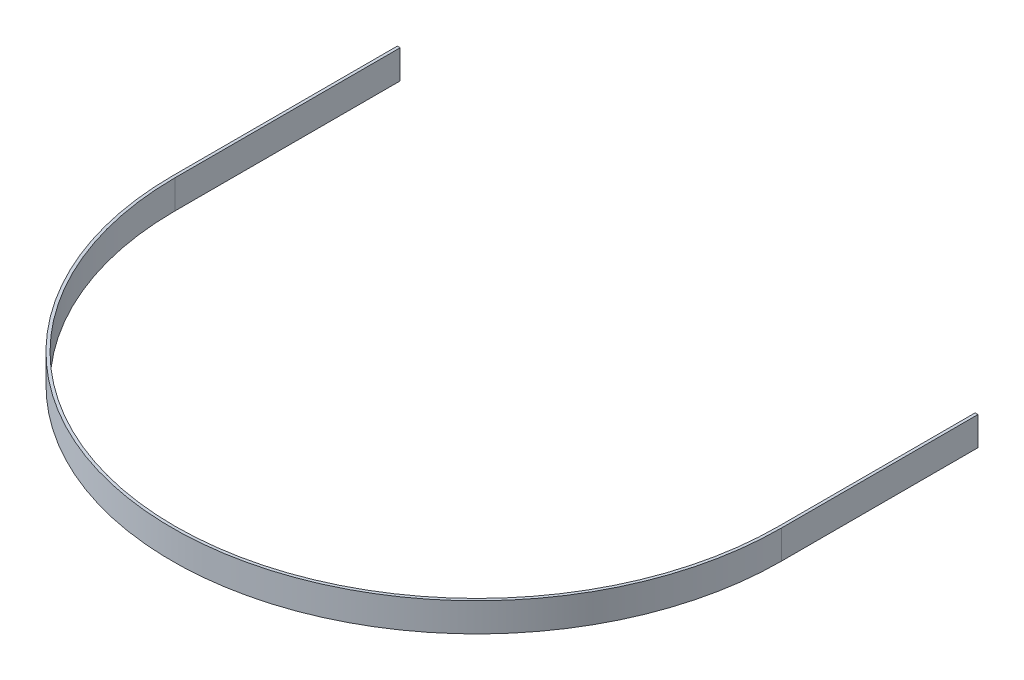
ISO-10303-21;
HEADER;
FILE_DESCRIPTION(('STEP AP214'),'2;1');
FILE_NAME('part.step','',(''),(''),'','','');
FILE_SCHEMA(('AUTOMOTIVE_DESIGN { 1 0 10303 214 1 1 1 1 }'));
ENDSEC;
DATA;
#1=APPLICATION_CONTEXT('core data for automotive mechanical design processes');
#2=APPLICATION_PROTOCOL_DEFINITION('international standard','automotive_design',2000,#1);
#3=PRODUCT_CONTEXT('',#1,'mechanical');
#4=PRODUCT('Part','Part','',(#3));
#5=PRODUCT_RELATED_PRODUCT_CATEGORY('part','',(#4));
#6=PRODUCT_DEFINITION_FORMATION('','',#4);
#7=PRODUCT_DEFINITION_CONTEXT('part definition',#1,'design');
#8=PRODUCT_DEFINITION('design','',#6,#7);
#9=PRODUCT_DEFINITION_SHAPE('','',#8);
#10=(LENGTH_UNIT() NAMED_UNIT(*) SI_UNIT(.MILLI.,.METRE.));
#11=(NAMED_UNIT(*) PLANE_ANGLE_UNIT() SI_UNIT($,.RADIAN.));
#12=(NAMED_UNIT(*) SI_UNIT($,.STERADIAN.) SOLID_ANGLE_UNIT());
#13=UNCERTAINTY_MEASURE_WITH_UNIT(LENGTH_MEASURE(1.E-05),#10,'distance_accuracy_value','');
#14=(GEOMETRIC_REPRESENTATION_CONTEXT(3) GLOBAL_UNCERTAINTY_ASSIGNED_CONTEXT((#13)) GLOBAL_UNIT_ASSIGNED_CONTEXT((#10,
#11,#12)) REPRESENTATION_CONTEXT('',''));
#15=CARTESIAN_POINT('',(0.,0.,0.));
#16=DIRECTION('',(0.,0.,1.));
#17=DIRECTION('',(1.,0.,0.));
#18=AXIS2_PLACEMENT_3D('',#15,#16,#17);
#19=CARTESIAN_POINT('',(-31.8,3.,0.));
#20=DIRECTION('',(0.,0.,1.));
#21=DIRECTION('',(1.,0.,0.));
#22=AXIS2_PLACEMENT_3D('',#19,#20,#21);
#23=PLANE('',#22);
#24=DIRECTION('',(-1.,0.,0.));
#25=VECTOR('',#24,1.);
#26=CARTESIAN_POINT('',(-31.8,0.,0.));
#27=LINE('',#26,#25);
#28=CARTESIAN_POINT('',(-31.5,0.,0.));
#29=VERTEX_POINT('',#28);
#30=CARTESIAN_POINT('',(-31.8,0.,0.));
#31=VERTEX_POINT('',#30);
#32=EDGE_CURVE('E131',#29,#31,#27,.T.);
#33=ORIENTED_EDGE('',*,*,#32,.T.);
#34=DIRECTION('',(0.,-1.,0.));
#35=VECTOR('',#34,1.);
#36=CARTESIAN_POINT('',(-31.8,3.,0.));
#37=LINE('',#36,#35);
#38=CARTESIAN_POINT('',(-31.8,3.,0.));
#39=VERTEX_POINT('',#38);
#40=EDGE_CURVE('E11',#39,#31,#37,.T.);
#41=ORIENTED_EDGE('',*,*,#40,.F.);
#42=DIRECTION('',(-1.,0.,0.));
#43=VECTOR('',#42,1.);
#44=CARTESIAN_POINT('',(-31.8,3.,0.));
#45=LINE('',#44,#43);
#46=CARTESIAN_POINT('',(-31.5,3.,0.));
#47=VERTEX_POINT('',#46);
#48=EDGE_CURVE('E145',#47,#39,#45,.T.);
#49=ORIENTED_EDGE('',*,*,#48,.F.);
#50=DIRECTION('',(0.,-1.,0.));
#51=VECTOR('',#50,1.);
#52=CARTESIAN_POINT('',(-31.5,3.,0.));
#53=LINE('',#52,#51);
#54=EDGE_CURVE('E127',#47,#29,#53,.T.);
#55=ORIENTED_EDGE('',*,*,#54,.T.);
#56=EDGE_LOOP('',(#33,#41,#49,#55));
#57=FACE_BOUND('',#56,.T.);
#58=ADVANCED_FACE('F35',(#57),#23,.F.);
#59=CARTESIAN_POINT('',(-31.8,3.,0.));
#60=DIRECTION('',(1.,0.,0.));
#61=DIRECTION('',(0.,0.,-1.));
#62=AXIS2_PLACEMENT_3D('',#59,#60,#61);
#63=PLANE('',#62);
#64=DIRECTION('',(0.,0.,1.));
#65=VECTOR('',#64,1.);
#66=CARTESIAN_POINT('',(-31.8,0.,0.));
#67=LINE('',#66,#65);
#68=CARTESIAN_POINT('',(-31.8000000000001,0.,23.5));
#69=VERTEX_POINT('',#68);
#70=EDGE_CURVE('E134',#31,#69,#67,.T.);
#71=ORIENTED_EDGE('',*,*,#70,.T.);
#72=DIRECTION('',(0.,-1.,0.));
#73=VECTOR('',#72,1.);
#74=CARTESIAN_POINT('',(-31.8000000000001,3.,23.5));
#75=LINE('',#74,#73);
#76=CARTESIAN_POINT('',(-31.8000000000001,3.,23.5));
#77=VERTEX_POINT('',#76);
#78=EDGE_CURVE('E43',#77,#69,#75,.T.);
#79=ORIENTED_EDGE('',*,*,#78,.F.);
#80=DIRECTION('',(0.,0.,1.));
#81=VECTOR('',#80,1.);
#82=CARTESIAN_POINT('',(-31.8,3.,0.));
#83=LINE('',#82,#81);
#84=EDGE_CURVE('E94',#39,#77,#83,.T.);
#85=ORIENTED_EDGE('',*,*,#84,.F.);
#86=ORIENTED_EDGE('',*,*,#40,.T.);
#87=EDGE_LOOP('',(#71,#79,#85,#86));
#88=FACE_BOUND('',#87,.T.);
#89=ADVANCED_FACE('F180',(#88),#63,.F.);
#90=CARTESIAN_POINT('',(0.,3.,23.5));
#91=DIRECTION('',(0.,-1.,0.));
#92=DIRECTION('',(0.,0.,-1.));
#93=AXIS2_PLACEMENT_3D('',#90,#91,#92);
#94=CYLINDRICAL_SURFACE('',#93,31.8000000000001);
#95=CARTESIAN_POINT('',(0.,0.,23.5));
#96=DIRECTION('',(0.,1.,0.));
#97=DIRECTION('',(0.,0.,1.));
#98=AXIS2_PLACEMENT_3D('',#95,#96,#97);
#99=CIRCLE('',#98,31.8000000000001);
#100=CARTESIAN_POINT('',(31.8000000000001,0.,23.5));
#101=VERTEX_POINT('',#100);
#102=EDGE_CURVE('E136',#69,#101,#99,.T.);
#103=ORIENTED_EDGE('',*,*,#102,.T.);
#104=DIRECTION('',(0.,-1.,0.));
#105=VECTOR('',#104,1.);
#106=CARTESIAN_POINT('',(31.8000000000001,3.,23.5));
#107=LINE('',#106,#105);
#108=CARTESIAN_POINT('',(31.8000000000001,3.,23.5));
#109=VERTEX_POINT('',#108);
#110=EDGE_CURVE('E152',#109,#101,#107,.T.);
#111=ORIENTED_EDGE('',*,*,#110,.F.);
#112=CARTESIAN_POINT('',(0.,3.,23.5));
#113=DIRECTION('',(0.,1.,0.));
#114=DIRECTION('',(0.,0.,1.));
#115=AXIS2_PLACEMENT_3D('',#112,#113,#114);
#116=CIRCLE('',#115,31.8000000000001);
#117=EDGE_CURVE('E160',#77,#109,#116,.T.);
#118=ORIENTED_EDGE('',*,*,#117,.F.);
#119=ORIENTED_EDGE('',*,*,#78,.T.);
#120=EDGE_LOOP('',(#103,#111,#118,#119));
#121=FACE_BOUND('',#120,.T.);
#122=ADVANCED_FACE('F158',(#121),#94,.T.);
#123=CARTESIAN_POINT('',(31.8000000000001,3.,23.5));
#124=DIRECTION('',(-1.,0.,0.));
#125=DIRECTION('',(0.,0.,1.));
#126=AXIS2_PLACEMENT_3D('',#123,#124,#125);
#127=PLANE('',#126);
#128=DIRECTION('',(0.,0.,-1.));
#129=VECTOR('',#128,1.);
#130=CARTESIAN_POINT('',(31.8000000000001,0.,23.5));
#131=LINE('',#130,#129);
#132=CARTESIAN_POINT('',(31.8,0.,3.));
#133=VERTEX_POINT('',#132);
#134=EDGE_CURVE('E138',#101,#133,#131,.T.);
#135=ORIENTED_EDGE('',*,*,#134,.T.);
#136=DIRECTION('',(0.,-1.,0.));
#137=VECTOR('',#136,1.);
#138=CARTESIAN_POINT('',(31.8,3.,3.));
#139=LINE('',#138,#137);
#140=CARTESIAN_POINT('',(31.8,3.,3.));
#141=VERTEX_POINT('',#140);
#142=EDGE_CURVE('E149',#141,#133,#139,.T.);
#143=ORIENTED_EDGE('',*,*,#142,.F.);
#144=DIRECTION('',(0.,0.,-1.));
#145=VECTOR('',#144,1.);
#146=CARTESIAN_POINT('',(31.8000000000001,3.,23.5));
#147=LINE('',#146,#145);
#148=EDGE_CURVE('E172',#109,#141,#147,.T.);
#149=ORIENTED_EDGE('',*,*,#148,.F.);
#150=ORIENTED_EDGE('',*,*,#110,.T.);
#151=EDGE_LOOP('',(#135,#143,#149,#150));
#152=FACE_BOUND('',#151,.T.);
#153=ADVANCED_FACE('F168',(#152),#127,.F.);
#154=CARTESIAN_POINT('',(31.5,3.,3.));
#155=DIRECTION('',(0.,0.,1.));
#156=DIRECTION('',(1.,0.,0.));
#157=AXIS2_PLACEMENT_3D('',#154,#155,#156);
#158=PLANE('',#157);
#159=DIRECTION('',(-1.,0.,0.));
#160=VECTOR('',#159,1.);
#161=CARTESIAN_POINT('',(31.5,0.,3.));
#162=LINE('',#161,#160);
#163=CARTESIAN_POINT('',(31.5,0.,3.));
#164=VERTEX_POINT('',#163);
#165=EDGE_CURVE('E140',#133,#164,#162,.T.);
#166=ORIENTED_EDGE('',*,*,#165,.T.);
#167=DIRECTION('',(0.,-1.,0.));
#168=VECTOR('',#167,1.);
#169=CARTESIAN_POINT('',(31.5,3.,3.));
#170=LINE('',#169,#168);
#171=CARTESIAN_POINT('',(31.5,3.,3.));
#172=VERTEX_POINT('',#171);
#173=EDGE_CURVE('E122',#172,#164,#170,.T.);
#174=ORIENTED_EDGE('',*,*,#173,.F.);
#175=DIRECTION('',(-1.,0.,0.));
#176=VECTOR('',#175,1.);
#177=CARTESIAN_POINT('',(31.5,3.,3.));
#178=LINE('',#177,#176);
#179=EDGE_CURVE('E113',#141,#172,#178,.T.);
#180=ORIENTED_EDGE('',*,*,#179,.F.);
#181=ORIENTED_EDGE('',*,*,#142,.T.);
#182=EDGE_LOOP('',(#166,#174,#180,#181));
#183=FACE_BOUND('',#182,.T.);
#184=ADVANCED_FACE('F171',(#183),#158,.F.);
#185=CARTESIAN_POINT('',(31.5,3.,23.5));
#186=DIRECTION('',(1.,0.,0.));
#187=DIRECTION('',(0.,0.,-1.));
#188=AXIS2_PLACEMENT_3D('',#185,#186,#187);
#189=PLANE('',#188);
#190=DIRECTION('',(0.,0.,1.));
#191=VECTOR('',#190,1.);
#192=CARTESIAN_POINT('',(31.5,0.,23.5));
#193=LINE('',#192,#191);
#194=CARTESIAN_POINT('',(31.5,0.,23.5));
#195=VERTEX_POINT('',#194);
#196=EDGE_CURVE('E121',#164,#195,#193,.T.);
#197=ORIENTED_EDGE('',*,*,#196,.T.);
#198=DIRECTION('',(0.,-1.,0.));
#199=VECTOR('',#198,1.);
#200=CARTESIAN_POINT('',(31.5,3.,23.5));
#201=LINE('',#200,#199);
#202=CARTESIAN_POINT('',(31.5,3.,23.5));
#203=VERTEX_POINT('',#202);
#204=EDGE_CURVE('E118',#203,#195,#201,.T.);
#205=ORIENTED_EDGE('',*,*,#204,.F.);
#206=DIRECTION('',(0.,0.,1.));
#207=VECTOR('',#206,1.);
#208=CARTESIAN_POINT('',(31.5,3.,23.5));
#209=LINE('',#208,#207);
#210=EDGE_CURVE('E107',#172,#203,#209,.T.);
#211=ORIENTED_EDGE('',*,*,#210,.F.);
#212=ORIENTED_EDGE('',*,*,#173,.T.);
#213=EDGE_LOOP('',(#197,#205,#211,#212));
#214=FACE_BOUND('',#213,.T.);
#215=ADVANCED_FACE('F119',(#214),#189,.F.);
#216=CARTESIAN_POINT('',(0.,3.,23.5));
#217=DIRECTION('',(0.,-1.,0.));
#218=DIRECTION('',(0.,0.,-1.));
#219=AXIS2_PLACEMENT_3D('',#216,#217,#218);
#220=CYLINDRICAL_SURFACE('',#219,31.5);
#221=CARTESIAN_POINT('',(0.,0.,23.5));
#222=DIRECTION('',(0.,-1.,0.));
#223=DIRECTION('',(0.,0.,1.));
#224=AXIS2_PLACEMENT_3D('',#221,#222,#223);
#225=CIRCLE('',#224,31.5);
#226=CARTESIAN_POINT('',(-31.5,0.,23.5));
#227=VERTEX_POINT('',#226);
#228=EDGE_CURVE('E80',#195,#227,#225,.T.);
#229=ORIENTED_EDGE('',*,*,#228,.T.);
#230=DIRECTION('',(0.,-1.,0.));
#231=VECTOR('',#230,1.);
#232=CARTESIAN_POINT('',(-31.5,3.,23.5));
#233=LINE('',#232,#231);
#234=CARTESIAN_POINT('',(-31.5,3.,23.5));
#235=VERTEX_POINT('',#234);
#236=EDGE_CURVE('E123',#235,#227,#233,.T.);
#237=ORIENTED_EDGE('',*,*,#236,.F.);
#238=CARTESIAN_POINT('',(0.,3.,23.5));
#239=DIRECTION('',(0.,-1.,0.));
#240=DIRECTION('',(0.,0.,1.));
#241=AXIS2_PLACEMENT_3D('',#238,#239,#240);
#242=CIRCLE('',#241,31.5);
#243=EDGE_CURVE('E111',#203,#235,#242,.T.);
#244=ORIENTED_EDGE('',*,*,#243,.F.);
#245=ORIENTED_EDGE('',*,*,#204,.T.);
#246=EDGE_LOOP('',(#229,#237,#244,#245));
#247=FACE_BOUND('',#246,.T.);
#248=ADVANCED_FACE('F125',(#247),#220,.F.);
#249=CARTESIAN_POINT('',(-31.5,3.,0.));
#250=DIRECTION('',(-1.,0.,0.));
#251=DIRECTION('',(0.,0.,1.));
#252=AXIS2_PLACEMENT_3D('',#249,#250,#251);
#253=PLANE('',#252);
#254=DIRECTION('',(0.,0.,-1.));
#255=VECTOR('',#254,1.);
#256=CARTESIAN_POINT('',(-31.5,0.,0.));
#257=LINE('',#256,#255);
#258=EDGE_CURVE('E86',#227,#29,#257,.T.);
#259=ORIENTED_EDGE('',*,*,#258,.T.);
#260=ORIENTED_EDGE('',*,*,#54,.F.);
#261=DIRECTION('',(0.,0.,-1.));
#262=VECTOR('',#261,1.);
#263=CARTESIAN_POINT('',(-31.5,3.,0.));
#264=LINE('',#263,#262);
#265=EDGE_CURVE('E51',#235,#47,#264,.T.);
#266=ORIENTED_EDGE('',*,*,#265,.F.);
#267=ORIENTED_EDGE('',*,*,#236,.T.);
#268=EDGE_LOOP('',(#259,#260,#266,#267));
#269=FACE_BOUND('',#268,.T.);
#270=ADVANCED_FACE('F196',(#269),#253,.F.);
#271=CARTESIAN_POINT('',(0.,3.,23.5));
#272=DIRECTION('',(0.,1.,0.));
#273=DIRECTION('',(0.,0.,1.));
#274=AXIS2_PLACEMENT_3D('',#271,#272,#273);
#275=PLANE('',#274);
#276=ORIENTED_EDGE('',*,*,#48,.T.);
#277=ORIENTED_EDGE('',*,*,#84,.T.);
#278=ORIENTED_EDGE('',*,*,#117,.T.);
#279=ORIENTED_EDGE('',*,*,#148,.T.);
#280=ORIENTED_EDGE('',*,*,#179,.T.);
#281=ORIENTED_EDGE('',*,*,#210,.T.);
#282=ORIENTED_EDGE('',*,*,#243,.T.);
#283=ORIENTED_EDGE('',*,*,#265,.T.);
#284=EDGE_LOOP('',(#276,#277,#278,#279,#280,#281,#282,#283));
#285=FACE_BOUND('',#284,.T.);
#286=ADVANCED_FACE('F109',(#285),#275,.T.);
#287=CARTESIAN_POINT('',(0.,0.,23.5));
#288=DIRECTION('',(0.,1.,0.));
#289=DIRECTION('',(0.,0.,1.));
#290=AXIS2_PLACEMENT_3D('',#287,#288,#289);
#291=PLANE('',#290);
#292=ORIENTED_EDGE('',*,*,#32,.F.);
#293=ORIENTED_EDGE('',*,*,#258,.F.);
#294=ORIENTED_EDGE('',*,*,#228,.F.);
#295=ORIENTED_EDGE('',*,*,#196,.F.);
#296=ORIENTED_EDGE('',*,*,#165,.F.);
#297=ORIENTED_EDGE('',*,*,#134,.F.);
#298=ORIENTED_EDGE('',*,*,#102,.F.);
#299=ORIENTED_EDGE('',*,*,#70,.F.);
#300=EDGE_LOOP('',(#292,#293,#294,#295,#296,#297,#298,#299));
#301=FACE_BOUND('',#300,.T.);
#302=ADVANCED_FACE('F164',(#301),#291,.F.);
#303=CLOSED_SHELL('',(#58,#89,#122,#153,#184,#215,#248,#270,#286,#302));
#304=MANIFOLD_SOLID_BREP('B2',#303);
#305=ADVANCED_BREP_SHAPE_REPRESENTATION('',(#18,#304),#14);
#306=SHAPE_DEFINITION_REPRESENTATION(#9,#305);
ENDSEC;
END-ISO-10303-21;
